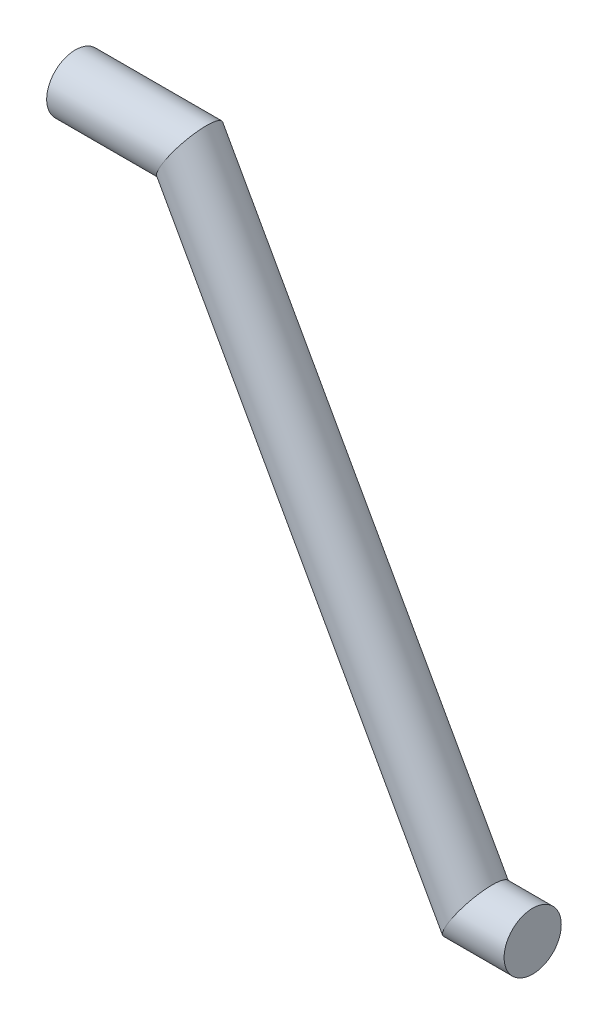
ISO-10303-21;
HEADER;
FILE_DESCRIPTION(('STEP AP214'),'2;1');
FILE_NAME('part.step','',(''),(''),'','','');
FILE_SCHEMA(('AUTOMOTIVE_DESIGN { 1 0 10303 214 1 1 1 1 }'));
ENDSEC;
DATA;
#1=APPLICATION_CONTEXT('core data for automotive mechanical design processes');
#2=APPLICATION_PROTOCOL_DEFINITION('international standard','automotive_design',2000,#1);
#3=PRODUCT_CONTEXT('',#1,'mechanical');
#4=PRODUCT('Part','Part','',(#3));
#5=PRODUCT_RELATED_PRODUCT_CATEGORY('part','',(#4));
#6=PRODUCT_DEFINITION_FORMATION('','',#4);
#7=PRODUCT_DEFINITION_CONTEXT('part definition',#1,'design');
#8=PRODUCT_DEFINITION('design','',#6,#7);
#9=PRODUCT_DEFINITION_SHAPE('','',#8);
#10=(LENGTH_UNIT() NAMED_UNIT(*) SI_UNIT(.MILLI.,.METRE.));
#11=(NAMED_UNIT(*) PLANE_ANGLE_UNIT() SI_UNIT($,.RADIAN.));
#12=(NAMED_UNIT(*) SI_UNIT($,.STERADIAN.) SOLID_ANGLE_UNIT());
#13=UNCERTAINTY_MEASURE_WITH_UNIT(LENGTH_MEASURE(1.E-05),#10,'distance_accuracy_value','');
#14=(GEOMETRIC_REPRESENTATION_CONTEXT(3) GLOBAL_UNCERTAINTY_ASSIGNED_CONTEXT((#13)) GLOBAL_UNIT_ASSIGNED_CONTEXT((#10,
#11,#12)) REPRESENTATION_CONTEXT('',''));
#15=CARTESIAN_POINT('',(0.,0.,0.));
#16=DIRECTION('',(0.,0.,1.));
#17=DIRECTION('',(1.,0.,0.));
#18=AXIS2_PLACEMENT_3D('',#15,#16,#17);
#19=CARTESIAN_POINT('',(400.,-450.,0.));
#20=DIRECTION('',(1.,0.,0.));
#21=DIRECTION('',(0.,0.,-1.));
#22=AXIS2_PLACEMENT_3D('',#19,#20,#21);
#23=PLANE('',#22);
#24=CARTESIAN_POINT('',(400.,-450.,0.));
#25=DIRECTION('',(1.,0.,0.));
#26=DIRECTION('',(0.,0.,-1.));
#27=AXIS2_PLACEMENT_3D('',#24,#25,#26);
#28=CIRCLE('',#27,25.);
#29=CARTESIAN_POINT('',(400.,-450.,-25.));
#30=VERTEX_POINT('',#29);
#31=EDGE_CURVE('E34',#30,#30,#28,.T.);
#32=ORIENTED_EDGE('',*,*,#31,.T.);
#33=EDGE_LOOP('',(#32));
#34=FACE_BOUND('',#33,.T.);
#35=ADVANCED_FACE('F31',(#34),#23,.T.);
#36=CARTESIAN_POINT('',(0.,0.,0.));
#37=DIRECTION('',(1.,0.,0.));
#38=DIRECTION('',(0.,0.,-1.));
#39=AXIS2_PLACEMENT_3D('',#36,#37,#38);
#40=PLANE('',#39);
#41=CARTESIAN_POINT('',(0.,0.,0.));
#42=DIRECTION('',(1.,0.,0.));
#43=DIRECTION('',(0.,0.,-1.));
#44=AXIS2_PLACEMENT_3D('',#41,#42,#43);
#45=CIRCLE('',#44,25.);
#46=CARTESIAN_POINT('',(0.,0.,-25.));
#47=VERTEX_POINT('',#46);
#48=EDGE_CURVE('E38',#47,#47,#45,.T.);
#49=ORIENTED_EDGE('',*,*,#48,.F.);
#50=EDGE_LOOP('',(#49));
#51=FACE_BOUND('',#50,.T.);
#52=ADVANCED_FACE('F55',(#51),#40,.F.);
#53=CARTESIAN_POINT('',(317.537815805079,-450.,0.));
#54=DIRECTION('',(1.,0.,0.));
#55=DIRECTION('',(0.,0.,-1.));
#56=AXIS2_PLACEMENT_3D('',#53,#54,#55);
#57=CYLINDRICAL_SURFACE('',#56,25.);
#58=CARTESIAN_POINT('',(350.,-450.,0.));
#59=DIRECTION('',(0.861870910049362,-0.507127729877478,0.));
#60=DIRECTION('',(-0.507127729877478,-0.861870910049362,0.));
#61=AXIS2_PLACEMENT_3D('',#58,#59,#60);
#62=ELLIPSE('',#61,29.0066641169826,25.);
#63=CARTESIAN_POINT('',(335.289916275036,-475.,0.));
#64=VERTEX_POINT('',#63);
#65=EDGE_CURVE('E43',#64,#64,#62,.F.);
#66=ORIENTED_EDGE('',*,*,#65,.F.);
#67=EDGE_LOOP('',(#66));
#68=FACE_BOUND('',#67,.T.);
#69=ORIENTED_EDGE('',*,*,#31,.F.);
#70=EDGE_LOOP('',(#69));
#71=FACE_BOUND('',#70,.T.);
#72=ADVANCED_FACE('F52',(#68,#71),#57,.T.);
#73=CARTESIAN_POINT('',(84.2349697151181,28.3770545127874,0.));
#74=DIRECTION('',(0.485642931178632,-0.874157276121538,0.));
#75=DIRECTION('',(0.874157276121538,0.485642931178632,0.));
#76=AXIS2_PLACEMENT_3D('',#73,#74,#75);
#77=CYLINDRICAL_SURFACE('',#76,25.);
#78=CARTESIAN_POINT('',(100.,0.,0.));
#79=DIRECTION('',(0.861870910049362,-0.507127729877478,0.));
#80=DIRECTION('',(0.507127729877478,0.861870910049362,0.));
#81=AXIS2_PLACEMENT_3D('',#78,#79,#80);
#82=ELLIPSE('',#81,29.0066641169826,25.);
#83=CARTESIAN_POINT('',(114.710083724964,25.,0.));
#84=VERTEX_POINT('',#83);
#85=EDGE_CURVE('E10',#84,#84,#82,.F.);
#86=ORIENTED_EDGE('',*,*,#85,.F.);
#87=EDGE_LOOP('',(#86));
#88=FACE_BOUND('',#87,.T.);
#89=ORIENTED_EDGE('',*,*,#65,.T.);
#90=EDGE_LOOP('',(#89));
#91=FACE_BOUND('',#90,.T.);
#92=ADVANCED_FACE('F54',(#88,#91),#77,.T.);
#93=CARTESIAN_POINT('',(0.,0.,0.));
#94=DIRECTION('',(1.,0.,0.));
#95=DIRECTION('',(0.,0.,-1.));
#96=AXIS2_PLACEMENT_3D('',#93,#94,#95);
#97=CYLINDRICAL_SURFACE('',#96,25.);
#98=ORIENTED_EDGE('',*,*,#48,.T.);
#99=EDGE_LOOP('',(#98));
#100=FACE_BOUND('',#99,.T.);
#101=ORIENTED_EDGE('',*,*,#85,.T.);
#102=EDGE_LOOP('',(#101));
#103=FACE_BOUND('',#102,.T.);
#104=ADVANCED_FACE('F62',(#100,#103),#97,.T.);
#105=CLOSED_SHELL('',(#35,#52,#72,#92,#104));
#106=MANIFOLD_SOLID_BREP('B2',#105);
#107=ADVANCED_BREP_SHAPE_REPRESENTATION('',(#18,#106),#14);
#108=SHAPE_DEFINITION_REPRESENTATION(#9,#107);
ENDSEC;
END-ISO-10303-21;
